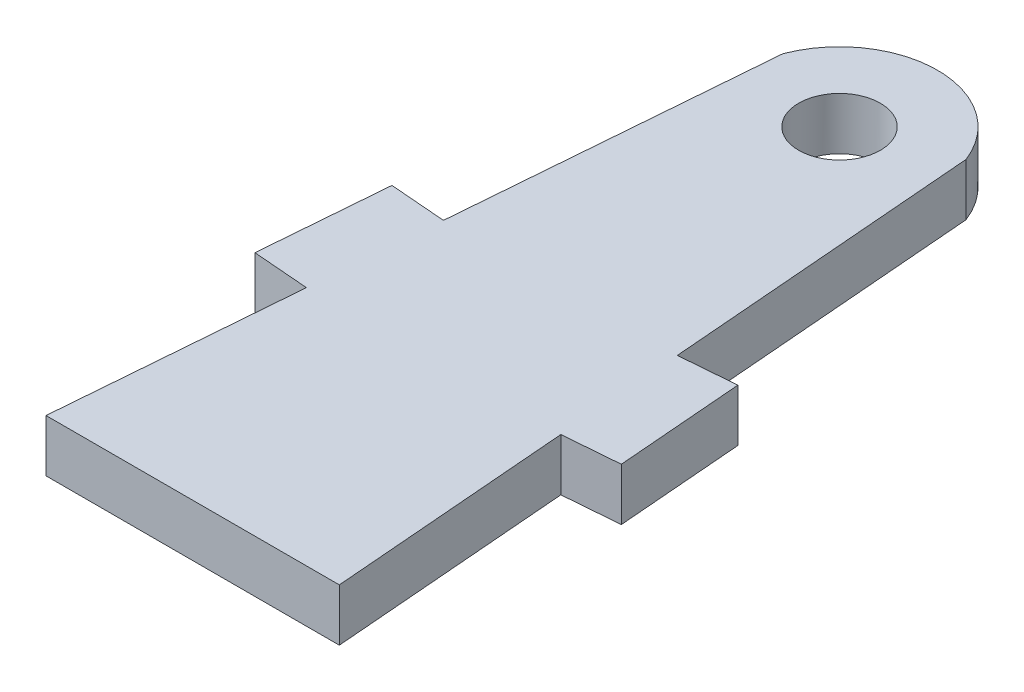
ISO-10303-21;
HEADER;
FILE_DESCRIPTION(('STEP AP214'),'2;1');
FILE_NAME('part.step','',(''),(''),'','','');
FILE_SCHEMA(('AUTOMOTIVE_DESIGN { 1 0 10303 214 1 1 1 1 }'));
ENDSEC;
DATA;
#1=APPLICATION_CONTEXT('core data for automotive mechanical design processes');
#2=APPLICATION_PROTOCOL_DEFINITION('international standard','automotive_design',2000,#1);
#3=PRODUCT_CONTEXT('',#1,'mechanical');
#4=PRODUCT('Part','Part','',(#3));
#5=PRODUCT_RELATED_PRODUCT_CATEGORY('part','',(#4));
#6=PRODUCT_DEFINITION_FORMATION('','',#4);
#7=PRODUCT_DEFINITION_CONTEXT('part definition',#1,'design');
#8=PRODUCT_DEFINITION('design','',#6,#7);
#9=PRODUCT_DEFINITION_SHAPE('','',#8);
#10=(LENGTH_UNIT() NAMED_UNIT(*) SI_UNIT(.MILLI.,.METRE.));
#11=(NAMED_UNIT(*) PLANE_ANGLE_UNIT() SI_UNIT($,.RADIAN.));
#12=(NAMED_UNIT(*) SI_UNIT($,.STERADIAN.) SOLID_ANGLE_UNIT());
#13=UNCERTAINTY_MEASURE_WITH_UNIT(LENGTH_MEASURE(1.E-05),#10,'distance_accuracy_value','');
#14=(GEOMETRIC_REPRESENTATION_CONTEXT(3) GLOBAL_UNCERTAINTY_ASSIGNED_CONTEXT((#13)) GLOBAL_UNIT_ASSIGNED_CONTEXT((#10,
#11,#12)) REPRESENTATION_CONTEXT('',''));
#15=CARTESIAN_POINT('',(0.,0.,0.));
#16=DIRECTION('',(0.,0.,1.));
#17=DIRECTION('',(1.,0.,0.));
#18=AXIS2_PLACEMENT_3D('',#15,#16,#17);
#19=CARTESIAN_POINT('',(15.,-1.00000000000001,57.));
#20=DIRECTION('',(0.,0.,-1.));
#21=DIRECTION('',(0.,1.,0.));
#22=AXIS2_PLACEMENT_3D('',#19,#20,#21);
#23=PLANE('',#22);
#24=DIRECTION('',(-1.,0.,0.));
#25=VECTOR('',#24,1.);
#26=CARTESIAN_POINT('',(15.,-2.,57.));
#27=LINE('',#26,#25);
#28=CARTESIAN_POINT('',(11.2239025963508,-2.,57.));
#29=VERTEX_POINT('',#28);
#30=CARTESIAN_POINT('',(-11.2239025963508,-2.,57.));
#31=VERTEX_POINT('',#30);
#32=EDGE_CURVE('E11',#29,#31,#27,.T.);
#33=ORIENTED_EDGE('',*,*,#32,.F.);
#34=DIRECTION('',(0.,1.,0.));
#35=VECTOR('',#34,1.);
#36=CARTESIAN_POINT('',(11.2239025963508,-1.00000000000001,57.));
#37=LINE('',#36,#35);
#38=CARTESIAN_POINT('',(11.2239025963508,1.99999999999995,57.));
#39=VERTEX_POINT('',#38);
#40=EDGE_CURVE('E44',#29,#39,#37,.T.);
#41=ORIENTED_EDGE('',*,*,#40,.T.);
#42=DIRECTION('',(1.,0.,0.));
#43=VECTOR('',#42,1.);
#44=CARTESIAN_POINT('',(-11.2239025963508,1.99999999999995,57.));
#45=LINE('',#44,#43);
#46=CARTESIAN_POINT('',(-11.2239025963508,1.99999999999995,57.));
#47=VERTEX_POINT('',#46);
#48=EDGE_CURVE('E142',#47,#39,#45,.T.);
#49=ORIENTED_EDGE('',*,*,#48,.F.);
#50=DIRECTION('',(0.,-1.,0.));
#51=VECTOR('',#50,1.);
#52=CARTESIAN_POINT('',(-11.2239025963508,-1.00000000000001,57.));
#53=LINE('',#52,#51);
#54=EDGE_CURVE('E128',#47,#31,#53,.T.);
#55=ORIENTED_EDGE('',*,*,#54,.T.);
#56=EDGE_LOOP('',(#33,#41,#49,#55));
#57=FACE_BOUND('',#56,.T.);
#58=ADVANCED_FACE('F41',(#57),#23,.F.);
#59=CARTESIAN_POINT('',(15.,-2.,0.));
#60=DIRECTION('',(0.,-1.,0.));
#61=DIRECTION('',(0.,0.,-1.));
#62=AXIS2_PLACEMENT_3D('',#59,#60,#61);
#63=PLANE('',#62);
#64=CARTESIAN_POINT('',(0.,-2.,7.5));
#65=DIRECTION('',(0.,-1.,0.));
#66=DIRECTION('',(0.,0.,-1.));
#67=AXIS2_PLACEMENT_3D('',#64,#65,#66);
#68=CIRCLE('',#67,3.125);
#69=CARTESIAN_POINT('',(0.,-2.,4.375));
#70=VERTEX_POINT('',#69);
#71=EDGE_CURVE('E165',#70,#70,#68,.T.);
#72=ORIENTED_EDGE('',*,*,#71,.F.);
#73=EDGE_LOOP('',(#72));
#74=FACE_BOUND('',#73,.T.);
#75=DIRECTION('',(0.996750238596396,0.,-0.0805540927453614));
#76=VECTOR('',#75,1.);
#77=CARTESIAN_POINT('',(18.0619297801832,-2.,37.8873268253491));
#78=LINE('',#77,#76);
#79=CARTESIAN_POINT('',(9.73367359221874,-2.,38.5603892389755));
#80=VERTEX_POINT('',#79);
#81=CARTESIAN_POINT('',(14.0196996181832,-2.00000000000001,38.2140066401705));
#82=VERTEX_POINT('',#81);
#83=EDGE_CURVE('E216',#80,#82,#78,.T.);
#84=ORIENTED_EDGE('',*,*,#83,.F.);
#85=DIRECTION('',(-0.0805540927453614,0.,-0.996750238596396));
#86=VECTOR('',#85,1.);
#87=CARTESIAN_POINT('',(6.67174381203556,-2.,0.673062413626437));
#88=LINE('',#87,#86);
#89=EDGE_CURVE('E155',#29,#80,#88,.T.);
#90=ORIENTED_EDGE('',*,*,#89,.F.);
#91=ORIENTED_EDGE('',*,*,#32,.T.);
#92=DIRECTION('',(-0.0805540927453614,0.,0.996750238596396));
#93=VECTOR('',#92,1.);
#94=CARTESIAN_POINT('',(-6.47707495629471,-2.,-1.73570692128922));
#95=LINE('',#94,#93);
#96=CARTESIAN_POINT('',(-9.73367359221874,-2.,38.5603892389755));
#97=VERTEX_POINT('',#96);
#98=EDGE_CURVE('E60',#97,#31,#95,.T.);
#99=ORIENTED_EDGE('',*,*,#98,.F.);
#100=DIRECTION('',(-0.996750238596396,0.,-0.0805540927453614));
#101=VECTOR('',#100,1.);
#102=CARTESIAN_POINT('',(11.743401364076,-2.00000000000001,40.2960961602647));
#103=LINE('',#102,#101);
#104=CARTESIAN_POINT('',(-14.0196996181832,-2.00000000000001,38.2140066401705));
#105=VERTEX_POINT('',#104);
#106=EDGE_CURVE('E137',#97,#105,#103,.T.);
#107=ORIENTED_EDGE('',*,*,#106,.T.);
#108=DIRECTION('',(0.0805540927453614,0.,-0.996750238596396));
#109=VECTOR('',#108,1.);
#110=CARTESIAN_POINT('',(-15.1886147464591,-2.00000000000001,52.6777836290186));
#111=LINE('',#110,#109);
#112=CARTESIAN_POINT('',(-13.2356985677246,-2.00000000000001,28.5130317117494));
#113=VERTEX_POINT('',#112);
#114=EDGE_CURVE('E189',#105,#113,#111,.T.);
#115=ORIENTED_EDGE('',*,*,#114,.T.);
#116=DIRECTION('',(0.996750238596396,0.,0.0805540927453614));
#117=VECTOR('',#116,1.);
#118=CARTESIAN_POINT('',(12.5274024145346,-2.,30.5951212318437));
#119=LINE('',#118,#117);
#120=CARTESIAN_POINT('',(-8.94967254176012,-2.,28.8594143105544));
#121=VERTEX_POINT('',#120);
#122=EDGE_CURVE('E187',#113,#121,#119,.T.);
#123=ORIENTED_EDGE('',*,*,#122,.T.);
#124=DIRECTION('',(-0.0805540927453614,0.,0.996750238596396));
#125=VECTOR('',#124,1.);
#126=CARTESIAN_POINT('',(-6.47707495629471,-2.,-1.73570692128922));
#127=LINE('',#126,#125);
#128=CARTESIAN_POINT('',(-7.00743812312879,-2.,4.82683503118097));
#129=VERTEX_POINT('',#128);
#130=EDGE_CURVE('E181',#129,#121,#127,.T.);
#131=ORIENTED_EDGE('',*,*,#130,.F.);
#132=CARTESIAN_POINT('',(0.,-2.,7.5));
#133=DIRECTION('',(0.,-1.,0.));
#134=DIRECTION('',(0.,0.,-1.));
#135=AXIS2_PLACEMENT_3D('',#132,#133,#134);
#136=CIRCLE('',#135,7.5);
#137=CARTESIAN_POINT('',(7.00743812312879,-2.,4.82683503118097));
#138=VERTEX_POINT('',#137);
#139=EDGE_CURVE('E147',#138,#129,#136,.F.);
#140=ORIENTED_EDGE('',*,*,#139,.F.);
#141=DIRECTION('',(-0.0805540927453614,0.,-0.996750238596396));
#142=VECTOR('',#141,1.);
#143=CARTESIAN_POINT('',(6.67174381203556,-2.,0.673062413626437));
#144=LINE('',#143,#142);
#145=CARTESIAN_POINT('',(8.94967254176012,-2.,28.8594143105544));
#146=VERTEX_POINT('',#145);
#147=EDGE_CURVE('E158',#146,#138,#144,.T.);
#148=ORIENTED_EDGE('',*,*,#147,.F.);
#149=DIRECTION('',(-0.996750238596396,0.,0.0805540927453614));
#150=VECTOR('',#149,1.);
#151=CARTESIAN_POINT('',(17.2779287297246,-2.,28.186351896928));
#152=LINE('',#151,#150);
#153=CARTESIAN_POINT('',(13.2356985677246,-2.00000000000001,28.5130317117494));
#154=VERTEX_POINT('',#153);
#155=EDGE_CURVE('E211',#154,#146,#152,.T.);
#156=ORIENTED_EDGE('',*,*,#155,.F.);
#157=DIRECTION('',(-0.0805540927453614,0.,-0.996750238596396));
#158=VECTOR('',#157,1.);
#159=CARTESIAN_POINT('',(15.1886147464591,-2.00000000000001,52.6777836290186));
#160=LINE('',#159,#158);
#161=EDGE_CURVE('E172',#82,#154,#160,.T.);
#162=ORIENTED_EDGE('',*,*,#161,.F.);
#163=EDGE_LOOP('',(#84,#90,#91,#99,#107,#115,#123,#131,#140,#148,#156,#162));
#164=FACE_BOUND('',#163,.T.);
#165=ADVANCED_FACE('F243',(#74,#164),#63,.T.);
#166=CARTESIAN_POINT('',(-6.57440938416514,0.,-0.531322253831391));
#167=DIRECTION('',(0.996750238596396,0.,0.0805540927453614));
#168=DIRECTION('',(0.0805540927453614,0.,-0.996750238596396));
#169=AXIS2_PLACEMENT_3D('',#166,#167,#168);
#170=PLANE('',#169);
#171=ORIENTED_EDGE('',*,*,#98,.T.);
#172=ORIENTED_EDGE('',*,*,#54,.F.);
#173=DIRECTION('',(-0.0805540927453614,0.,0.996750238596396));
#174=VECTOR('',#173,1.);
#175=CARTESIAN_POINT('',(-6.47707495629471,2.,-1.73570692128922));
#176=LINE('',#175,#174);
#177=CARTESIAN_POINT('',(-9.73367359221874,2.,38.5603892389755));
#178=VERTEX_POINT('',#177);
#179=EDGE_CURVE('E131',#178,#47,#176,.T.);
#180=ORIENTED_EDGE('',*,*,#179,.F.);
#181=DIRECTION('',(0.,1.,0.));
#182=VECTOR('',#181,1.);
#183=CARTESIAN_POINT('',(-9.73367359221874,-4.38977617992705,38.5603892389755));
#184=LINE('',#183,#182);
#185=EDGE_CURVE('E197',#97,#178,#184,.T.);
#186=ORIENTED_EDGE('',*,*,#185,.F.);
#187=EDGE_LOOP('',(#171,#172,#180,#186));
#188=FACE_BOUND('',#187,.T.);
#189=ADVANCED_FACE('F130',(#188),#170,.F.);
#190=CARTESIAN_POINT('',(6.57440938416514,0.,-0.531322253831391));
#191=DIRECTION('',(-0.996750238596396,0.,0.0805540927453614));
#192=DIRECTION('',(-0.0805540927453614,0.,-0.996750238596396));
#193=AXIS2_PLACEMENT_3D('',#190,#191,#192);
#194=PLANE('',#193);
#195=DIRECTION('',(-0.0805540927453614,0.,-0.996750238596396));
#196=VECTOR('',#195,1.);
#197=CARTESIAN_POINT('',(6.67174381203556,2.,0.673062413626438));
#198=LINE('',#197,#196);
#199=CARTESIAN_POINT('',(9.73367359221874,2.,38.5603892389755));
#200=VERTEX_POINT('',#199);
#201=EDGE_CURVE('E219',#39,#200,#198,.T.);
#202=ORIENTED_EDGE('',*,*,#201,.F.);
#203=ORIENTED_EDGE('',*,*,#40,.F.);
#204=ORIENTED_EDGE('',*,*,#89,.T.);
#205=DIRECTION('',(0.,1.,0.));
#206=VECTOR('',#205,1.);
#207=CARTESIAN_POINT('',(9.73367359221874,-4.38977617992705,38.5603892389755));
#208=LINE('',#207,#206);
#209=EDGE_CURVE('E157',#80,#200,#208,.T.);
#210=ORIENTED_EDGE('',*,*,#209,.T.);
#211=EDGE_LOOP('',(#202,#203,#204,#210));
#212=FACE_BOUND('',#211,.T.);
#213=ADVANCED_FACE('F260',(#212),#194,.F.);
#214=CARTESIAN_POINT('',(15.,2.,0.));
#215=DIRECTION('',(0.,-1.,0.));
#216=DIRECTION('',(0.,0.,-1.));
#217=AXIS2_PLACEMENT_3D('',#214,#215,#216);
#218=PLANE('',#217);
#219=ORIENTED_EDGE('',*,*,#201,.T.);
#220=DIRECTION('',(0.996750238596396,0.,-0.0805540927453614));
#221=VECTOR('',#220,1.);
#222=CARTESIAN_POINT('',(18.0619297801832,2.,37.8873268253491));
#223=LINE('',#222,#221);
#224=CARTESIAN_POINT('',(14.0196996181832,1.99999999999999,38.2140066401705));
#225=VERTEX_POINT('',#224);
#226=EDGE_CURVE('E210',#200,#225,#223,.T.);
#227=ORIENTED_EDGE('',*,*,#226,.T.);
#228=DIRECTION('',(0.0805540927453614,0.,0.996750238596396));
#229=VECTOR('',#228,1.);
#230=CARTESIAN_POINT('',(15.4310649299438,1.99999999999999,55.6777836290186));
#231=LINE('',#230,#229);
#232=CARTESIAN_POINT('',(13.2356985677246,2.,28.5130317117494));
#233=VERTEX_POINT('',#232);
#234=EDGE_CURVE('E178',#233,#225,#231,.T.);
#235=ORIENTED_EDGE('',*,*,#234,.F.);
#236=DIRECTION('',(-0.996750238596396,0.,0.0805540927453614));
#237=VECTOR('',#236,1.);
#238=CARTESIAN_POINT('',(17.2779287297246,2.,28.186351896928));
#239=LINE('',#238,#237);
#240=CARTESIAN_POINT('',(8.94967254176012,2.,28.8594143105544));
#241=VERTEX_POINT('',#240);
#242=EDGE_CURVE('E208',#233,#241,#239,.T.);
#243=ORIENTED_EDGE('',*,*,#242,.T.);
#244=DIRECTION('',(-0.0805540927453614,0.,-0.996750238596396));
#245=VECTOR('',#244,1.);
#246=CARTESIAN_POINT('',(6.67174381203556,2.,0.673062413626438));
#247=LINE('',#246,#245);
#248=CARTESIAN_POINT('',(7.00743812312879,1.99999999999999,4.82683503118098));
#249=VERTEX_POINT('',#248);
#250=EDGE_CURVE('E164',#241,#249,#247,.T.);
#251=ORIENTED_EDGE('',*,*,#250,.T.);
#252=CARTESIAN_POINT('',(0.,2.,7.5));
#253=DIRECTION('',(0.,-1.,0.));
#254=DIRECTION('',(0.,0.,1.));
#255=AXIS2_PLACEMENT_3D('',#252,#253,#254);
#256=CIRCLE('',#255,7.5);
#257=CARTESIAN_POINT('',(-7.00743812312879,2.,4.82683503118097));
#258=VERTEX_POINT('',#257);
#259=EDGE_CURVE('E174',#258,#249,#256,.T.);
#260=ORIENTED_EDGE('',*,*,#259,.F.);
#261=DIRECTION('',(-0.0805540927453614,0.,0.996750238596396));
#262=VECTOR('',#261,1.);
#263=CARTESIAN_POINT('',(-6.47707495629472,2.,-1.73570692128922));
#264=LINE('',#263,#262);
#265=CARTESIAN_POINT('',(-8.94967254176012,2.,28.8594143105544));
#266=VERTEX_POINT('',#265);
#267=EDGE_CURVE('E148',#258,#266,#264,.T.);
#268=ORIENTED_EDGE('',*,*,#267,.T.);
#269=DIRECTION('',(0.996750238596396,0.,0.0805540927453614));
#270=VECTOR('',#269,1.);
#271=CARTESIAN_POINT('',(12.5274024145346,2.,30.5951212318437));
#272=LINE('',#271,#270);
#273=CARTESIAN_POINT('',(-13.2356985677246,2.,28.5130317117494));
#274=VERTEX_POINT('',#273);
#275=EDGE_CURVE('E190',#274,#266,#272,.T.);
#276=ORIENTED_EDGE('',*,*,#275,.F.);
#277=DIRECTION('',(0.0805540927453614,0.,-0.996750238596396));
#278=VECTOR('',#277,1.);
#279=CARTESIAN_POINT('',(-15.4310649299438,1.99999999999999,55.6777836290186));
#280=LINE('',#279,#278);
#281=CARTESIAN_POINT('',(-14.0196996181832,2.,38.2140066401705));
#282=VERTEX_POINT('',#281);
#283=EDGE_CURVE('E182',#282,#274,#280,.T.);
#284=ORIENTED_EDGE('',*,*,#283,.F.);
#285=DIRECTION('',(-0.996750238596396,0.,-0.0805540927453614));
#286=VECTOR('',#285,1.);
#287=CARTESIAN_POINT('',(11.743401364076,1.99999999999999,40.2960961602647));
#288=LINE('',#287,#286);
#289=EDGE_CURVE('E144',#178,#282,#288,.T.);
#290=ORIENTED_EDGE('',*,*,#289,.F.);
#291=ORIENTED_EDGE('',*,*,#179,.T.);
#292=ORIENTED_EDGE('',*,*,#48,.T.);
#293=EDGE_LOOP('',(#219,#227,#235,#243,#251,#260,#268,#276,#284,#290,#291,#292));
#294=FACE_BOUND('',#293,.T.);
#295=CARTESIAN_POINT('',(0.,2.,7.5));
#296=DIRECTION('',(0.,1.,0.));
#297=DIRECTION('',(0.,0.,1.));
#298=AXIS2_PLACEMENT_3D('',#295,#296,#297);
#299=CIRCLE('',#298,3.125);
#300=CARTESIAN_POINT('',(0.,2.,10.625));
#301=VERTEX_POINT('',#300);
#302=EDGE_CURVE('E168',#301,#301,#299,.T.);
#303=ORIENTED_EDGE('',*,*,#302,.F.);
#304=EDGE_LOOP('',(#303));
#305=FACE_BOUND('',#304,.T.);
#306=ADVANCED_FACE('F140',(#294,#305),#218,.F.);
#307=CARTESIAN_POINT('',(0.,-48.,7.49999999999999));
#308=DIRECTION('',(0.,1.,0.));
#309=DIRECTION('',(0.,0.,1.));
#310=AXIS2_PLACEMENT_3D('',#307,#308,#309);
#311=CYLINDRICAL_SURFACE('',#310,7.5);
#312=DIRECTION('',(0.,1.,0.));
#313=VECTOR('',#312,1.);
#314=CARTESIAN_POINT('',(7.00743812312879,-48.,4.82683503118097));
#315=LINE('',#314,#313);
#316=EDGE_CURVE('E159',#138,#249,#315,.T.);
#317=ORIENTED_EDGE('',*,*,#316,.F.);
#318=ORIENTED_EDGE('',*,*,#139,.T.);
#319=DIRECTION('',(0.,1.,0.));
#320=VECTOR('',#319,1.);
#321=CARTESIAN_POINT('',(-7.00743812312879,-48.,4.82683503118097));
#322=LINE('',#321,#320);
#323=EDGE_CURVE('E186',#258,#129,#322,.F.);
#324=ORIENTED_EDGE('',*,*,#323,.F.);
#325=ORIENTED_EDGE('',*,*,#259,.T.);
#326=EDGE_LOOP('',(#317,#318,#324,#325));
#327=FACE_BOUND('',#326,.T.);
#328=ADVANCED_FACE('F251',(#327),#311,.T.);
#329=CARTESIAN_POINT('',(-15.4310649299438,-45.,55.6777836290186));
#330=DIRECTION('',(-0.996750238596396,0.,-0.0805540927453614));
#331=DIRECTION('',(0.0805540927453614,0.,-0.996750238596396));
#332=AXIS2_PLACEMENT_3D('',#329,#330,#331);
#333=PLANE('',#332);
#334=ORIENTED_EDGE('',*,*,#114,.F.);
#335=DIRECTION('',(0.,1.,0.));
#336=VECTOR('',#335,1.);
#337=CARTESIAN_POINT('',(-14.0196996181832,-4.38977617992705,38.2140066401705));
#338=LINE('',#337,#336);
#339=EDGE_CURVE('E177',#105,#282,#338,.T.);
#340=ORIENTED_EDGE('',*,*,#339,.T.);
#341=ORIENTED_EDGE('',*,*,#283,.T.);
#342=DIRECTION('',(0.,-1.,0.));
#343=VECTOR('',#342,1.);
#344=CARTESIAN_POINT('',(-13.2356985677246,2.3,28.5130317117494));
#345=LINE('',#344,#343);
#346=EDGE_CURVE('E169',#274,#113,#345,.T.);
#347=ORIENTED_EDGE('',*,*,#346,.T.);
#348=EDGE_LOOP('',(#334,#340,#341,#347));
#349=FACE_BOUND('',#348,.T.);
#350=ADVANCED_FACE('F285',(#349),#333,.T.);
#351=CARTESIAN_POINT('',(0.,-48.,7.49999999999999));
#352=DIRECTION('',(0.,1.,0.));
#353=DIRECTION('',(0.,0.,1.));
#354=AXIS2_PLACEMENT_3D('',#351,#352,#353);
#355=CYLINDRICAL_SURFACE('',#354,3.125);
#356=ORIENTED_EDGE('',*,*,#71,.T.);
#357=EDGE_LOOP('',(#356));
#358=FACE_BOUND('',#357,.T.);
#359=ORIENTED_EDGE('',*,*,#302,.T.);
#360=EDGE_LOOP('',(#359));
#361=FACE_BOUND('',#360,.T.);
#362=ADVANCED_FACE('F284',(#358,#361),#355,.F.);
#363=CARTESIAN_POINT('',(15.4310649299438,-45.,55.6777836290186));
#364=DIRECTION('',(0.996750238596396,0.,-0.0805540927453614));
#365=DIRECTION('',(-0.0805540927453614,0.,-0.996750238596396));
#366=AXIS2_PLACEMENT_3D('',#363,#364,#365);
#367=PLANE('',#366);
#368=DIRECTION('',(0.,1.,0.));
#369=VECTOR('',#368,1.);
#370=CARTESIAN_POINT('',(14.0196996181832,-4.38977617992705,38.2140066401705));
#371=LINE('',#370,#369);
#372=EDGE_CURVE('E51',#82,#225,#371,.T.);
#373=ORIENTED_EDGE('',*,*,#372,.F.);
#374=ORIENTED_EDGE('',*,*,#161,.T.);
#375=DIRECTION('',(0.,-1.,0.));
#376=VECTOR('',#375,1.);
#377=CARTESIAN_POINT('',(13.2356985677246,2.3,28.5130317117494));
#378=LINE('',#377,#376);
#379=EDGE_CURVE('E213',#233,#154,#378,.T.);
#380=ORIENTED_EDGE('',*,*,#379,.F.);
#381=ORIENTED_EDGE('',*,*,#234,.T.);
#382=EDGE_LOOP('',(#373,#374,#380,#381));
#383=FACE_BOUND('',#382,.T.);
#384=ADVANCED_FACE('F234',(#383),#367,.T.);
#385=CARTESIAN_POINT('',(-6.57440938416514,0.,-0.53132225383139));
#386=DIRECTION('',(0.996750238596396,0.,0.0805540927453614));
#387=DIRECTION('',(0.0805540927453614,0.,-0.996750238596396));
#388=AXIS2_PLACEMENT_3D('',#385,#386,#387);
#389=PLANE('',#388);
#390=ORIENTED_EDGE('',*,*,#130,.T.);
#391=DIRECTION('',(0.,-1.,0.));
#392=VECTOR('',#391,1.);
#393=CARTESIAN_POINT('',(-8.94967254176012,2.3,28.8594143105544));
#394=LINE('',#393,#392);
#395=EDGE_CURVE('E192',#266,#121,#394,.T.);
#396=ORIENTED_EDGE('',*,*,#395,.F.);
#397=ORIENTED_EDGE('',*,*,#267,.F.);
#398=ORIENTED_EDGE('',*,*,#323,.T.);
#399=EDGE_LOOP('',(#390,#396,#397,#398));
#400=FACE_BOUND('',#399,.T.);
#401=ADVANCED_FACE('F283',(#400),#389,.F.);
#402=CARTESIAN_POINT('',(-8.94967254176012,2.3,28.8594143105544));
#403=DIRECTION('',(0.0805540927453614,0.,-0.996750238596396));
#404=DIRECTION('',(-0.996750238596396,0.,-0.0805540927453614));
#405=AXIS2_PLACEMENT_3D('',#402,#403,#404);
#406=PLANE('',#405);
#407=ORIENTED_EDGE('',*,*,#275,.T.);
#408=ORIENTED_EDGE('',*,*,#395,.T.);
#409=ORIENTED_EDGE('',*,*,#122,.F.);
#410=ORIENTED_EDGE('',*,*,#346,.F.);
#411=EDGE_LOOP('',(#407,#408,#409,#410));
#412=FACE_BOUND('',#411,.T.);
#413=ADVANCED_FACE('F299',(#412),#406,.T.);
#414=CARTESIAN_POINT('',(-9.73367359221874,-4.38977617992705,38.5603892389755));
#415=DIRECTION('',(-0.0805540927453614,0.,0.996750238596396));
#416=DIRECTION('',(0.996750238596396,0.,0.0805540927453614));
#417=AXIS2_PLACEMENT_3D('',#414,#415,#416);
#418=PLANE('',#417);
#419=ORIENTED_EDGE('',*,*,#185,.T.);
#420=ORIENTED_EDGE('',*,*,#289,.T.);
#421=ORIENTED_EDGE('',*,*,#339,.F.);
#422=ORIENTED_EDGE('',*,*,#106,.F.);
#423=EDGE_LOOP('',(#419,#420,#421,#422));
#424=FACE_BOUND('',#423,.T.);
#425=ADVANCED_FACE('F307',(#424),#418,.T.);
#426=CARTESIAN_POINT('',(6.57440938416514,0.,-0.53132225383139));
#427=DIRECTION('',(-0.996750238596396,0.,0.0805540927453614));
#428=DIRECTION('',(-0.0805540927453614,0.,-0.996750238596396));
#429=AXIS2_PLACEMENT_3D('',#426,#427,#428);
#430=PLANE('',#429);
#431=DIRECTION('',(0.,-1.,0.));
#432=VECTOR('',#431,1.);
#433=CARTESIAN_POINT('',(8.94967254176012,2.3,28.8594143105544));
#434=LINE('',#433,#432);
#435=EDGE_CURVE('E160',#241,#146,#434,.T.);
#436=ORIENTED_EDGE('',*,*,#435,.T.);
#437=ORIENTED_EDGE('',*,*,#147,.T.);
#438=ORIENTED_EDGE('',*,*,#316,.T.);
#439=ORIENTED_EDGE('',*,*,#250,.F.);
#440=EDGE_LOOP('',(#436,#437,#438,#439));
#441=FACE_BOUND('',#440,.T.);
#442=ADVANCED_FACE('F248',(#441),#430,.F.);
#443=CARTESIAN_POINT('',(8.94967254176012,2.3,28.8594143105544));
#444=DIRECTION('',(0.0805540927453614,0.,0.996750238596396));
#445=DIRECTION('',(0.996750238596396,0.,-0.0805540927453614));
#446=AXIS2_PLACEMENT_3D('',#443,#444,#445);
#447=PLANE('',#446);
#448=ORIENTED_EDGE('',*,*,#155,.T.);
#449=ORIENTED_EDGE('',*,*,#435,.F.);
#450=ORIENTED_EDGE('',*,*,#242,.F.);
#451=ORIENTED_EDGE('',*,*,#379,.T.);
#452=EDGE_LOOP('',(#448,#449,#450,#451));
#453=FACE_BOUND('',#452,.T.);
#454=ADVANCED_FACE('F240',(#453),#447,.F.);
#455=CARTESIAN_POINT('',(9.73367359221874,-4.38977617992705,38.5603892389755));
#456=DIRECTION('',(-0.0805540927453614,0.,-0.996750238596396));
#457=DIRECTION('',(-0.996750238596396,0.,0.0805540927453614));
#458=AXIS2_PLACEMENT_3D('',#455,#456,#457);
#459=PLANE('',#458);
#460=ORIENTED_EDGE('',*,*,#226,.F.);
#461=ORIENTED_EDGE('',*,*,#209,.F.);
#462=ORIENTED_EDGE('',*,*,#83,.T.);
#463=ORIENTED_EDGE('',*,*,#372,.T.);
#464=EDGE_LOOP('',(#460,#461,#462,#463));
#465=FACE_BOUND('',#464,.T.);
#466=ADVANCED_FACE('F258',(#465),#459,.F.);
#467=CLOSED_SHELL('',(#58,#165,#189,#213,#306,#328,#350,#362,#384,#401,#413,#425,#442,#454,#466));
#468=MANIFOLD_SOLID_BREP('B2',#467);
#469=ADVANCED_BREP_SHAPE_REPRESENTATION('',(#18,#468),#14);
#470=SHAPE_DEFINITION_REPRESENTATION(#9,#469);
ENDSEC;
END-ISO-10303-21;
